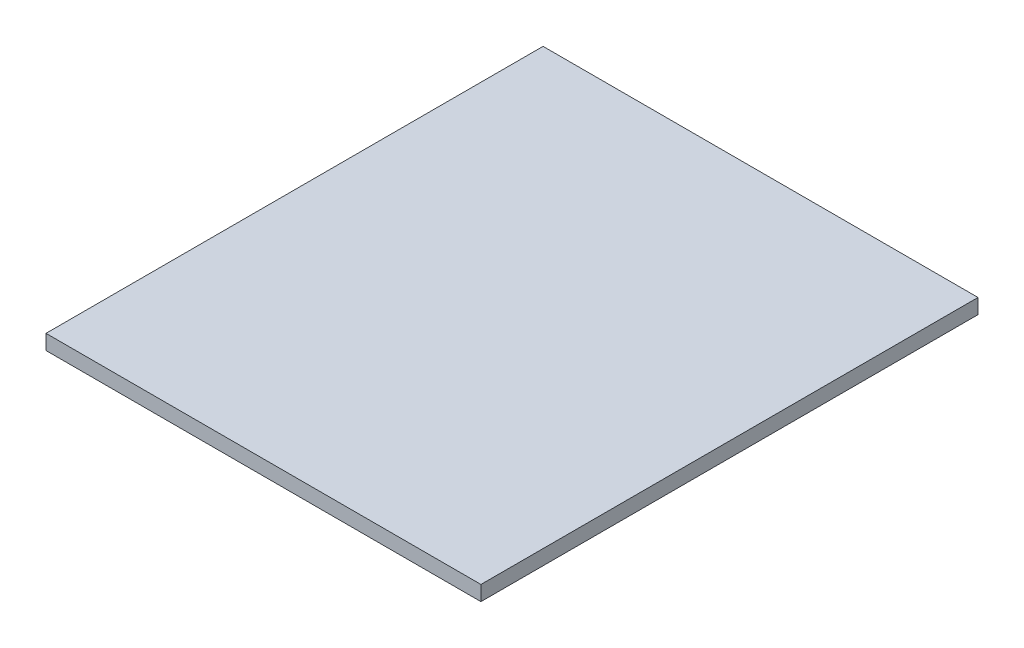
ISO-10303-21;
HEADER;
FILE_DESCRIPTION(('STEP AP214'),'2;1');
FILE_NAME('part.step','',(''),(''),'','','');
FILE_SCHEMA(('AUTOMOTIVE_DESIGN { 1 0 10303 214 1 1 1 1 }'));
ENDSEC;
DATA;
#1=APPLICATION_CONTEXT('core data for automotive mechanical design processes');
#2=APPLICATION_PROTOCOL_DEFINITION('international standard','automotive_design',2000,#1);
#3=PRODUCT_CONTEXT('',#1,'mechanical');
#4=PRODUCT('Part','Part','',(#3));
#5=PRODUCT_RELATED_PRODUCT_CATEGORY('part','',(#4));
#6=PRODUCT_DEFINITION_FORMATION('','',#4);
#7=PRODUCT_DEFINITION_CONTEXT('part definition',#1,'design');
#8=PRODUCT_DEFINITION('design','',#6,#7);
#9=PRODUCT_DEFINITION_SHAPE('','',#8);
#10=(LENGTH_UNIT() NAMED_UNIT(*) SI_UNIT(.MILLI.,.METRE.));
#11=(NAMED_UNIT(*) PLANE_ANGLE_UNIT() SI_UNIT($,.RADIAN.));
#12=(NAMED_UNIT(*) SI_UNIT($,.STERADIAN.) SOLID_ANGLE_UNIT());
#13=UNCERTAINTY_MEASURE_WITH_UNIT(LENGTH_MEASURE(1.E-05),#10,'distance_accuracy_value','');
#14=(GEOMETRIC_REPRESENTATION_CONTEXT(3) GLOBAL_UNCERTAINTY_ASSIGNED_CONTEXT((#13)) GLOBAL_UNIT_ASSIGNED_CONTEXT((#10,
#11,#12)) REPRESENTATION_CONTEXT('',''));
#15=CARTESIAN_POINT('',(0.,0.,0.));
#16=DIRECTION('',(0.,0.,1.));
#17=DIRECTION('',(1.,0.,0.));
#18=AXIS2_PLACEMENT_3D('',#15,#16,#17);
#19=CARTESIAN_POINT('',(0.,6.,0.));
#20=DIRECTION('',(1.,0.,0.));
#21=DIRECTION('',(0.,0.,-1.));
#22=AXIS2_PLACEMENT_3D('',#19,#20,#21);
#23=PLANE('',#22);
#24=DIRECTION('',(0.,0.,1.));
#25=VECTOR('',#24,1.);
#26=CARTESIAN_POINT('',(0.,0.,0.));
#27=LINE('',#26,#25);
#28=CARTESIAN_POINT('',(0.,0.,0.));
#29=VERTEX_POINT('',#28);
#30=CARTESIAN_POINT('',(0.,0.,200.));
#31=VERTEX_POINT('',#30);
#32=EDGE_CURVE('E95',#29,#31,#27,.T.);
#33=ORIENTED_EDGE('',*,*,#32,.T.);
#34=DIRECTION('',(0.,-1.,0.));
#35=VECTOR('',#34,1.);
#36=CARTESIAN_POINT('',(0.,6.,200.));
#37=LINE('',#36,#35);
#38=CARTESIAN_POINT('',(0.,6.,200.));
#39=VERTEX_POINT('',#38);
#40=EDGE_CURVE('E11',#39,#31,#37,.T.);
#41=ORIENTED_EDGE('',*,*,#40,.F.);
#42=DIRECTION('',(0.,0.,1.));
#43=VECTOR('',#42,1.);
#44=CARTESIAN_POINT('',(0.,6.,0.));
#45=LINE('',#44,#43);
#46=CARTESIAN_POINT('',(0.,6.,0.));
#47=VERTEX_POINT('',#46);
#48=EDGE_CURVE('E83',#47,#39,#45,.T.);
#49=ORIENTED_EDGE('',*,*,#48,.F.);
#50=DIRECTION('',(0.,-1.,0.));
#51=VECTOR('',#50,1.);
#52=CARTESIAN_POINT('',(0.,6.,0.));
#53=LINE('',#52,#51);
#54=EDGE_CURVE('E91',#47,#29,#53,.T.);
#55=ORIENTED_EDGE('',*,*,#54,.T.);
#56=EDGE_LOOP('',(#33,#41,#49,#55));
#57=FACE_BOUND('',#56,.T.);
#58=ADVANCED_FACE('F32',(#57),#23,.F.);
#59=CARTESIAN_POINT('',(0.,6.,200.));
#60=DIRECTION('',(0.,0.,-1.));
#61=DIRECTION('',(-1.,0.,0.));
#62=AXIS2_PLACEMENT_3D('',#59,#60,#61);
#63=PLANE('',#62);
#64=DIRECTION('',(1.,0.,0.));
#65=VECTOR('',#64,1.);
#66=CARTESIAN_POINT('',(0.,0.,200.));
#67=LINE('',#66,#65);
#68=CARTESIAN_POINT('',(175.,0.,200.));
#69=VERTEX_POINT('',#68);
#70=EDGE_CURVE('E87',#31,#69,#67,.T.);
#71=ORIENTED_EDGE('',*,*,#70,.T.);
#72=DIRECTION('',(0.,-1.,0.));
#73=VECTOR('',#72,1.);
#74=CARTESIAN_POINT('',(175.,6.,200.));
#75=LINE('',#74,#73);
#76=CARTESIAN_POINT('',(175.,6.,200.));
#77=VERTEX_POINT('',#76);
#78=EDGE_CURVE('E40',#77,#69,#75,.T.);
#79=ORIENTED_EDGE('',*,*,#78,.F.);
#80=DIRECTION('',(1.,0.,0.));
#81=VECTOR('',#80,1.);
#82=CARTESIAN_POINT('',(0.,6.,200.));
#83=LINE('',#82,#81);
#84=EDGE_CURVE('E78',#39,#77,#83,.T.);
#85=ORIENTED_EDGE('',*,*,#84,.F.);
#86=ORIENTED_EDGE('',*,*,#40,.T.);
#87=EDGE_LOOP('',(#71,#79,#85,#86));
#88=FACE_BOUND('',#87,.T.);
#89=ADVANCED_FACE('F86',(#88),#63,.F.);
#90=CARTESIAN_POINT('',(175.,6.,0.));
#91=DIRECTION('',(-1.,0.,0.));
#92=DIRECTION('',(0.,0.,1.));
#93=AXIS2_PLACEMENT_3D('',#90,#91,#92);
#94=PLANE('',#93);
#95=DIRECTION('',(0.,0.,-1.));
#96=VECTOR('',#95,1.);
#97=CARTESIAN_POINT('',(175.,0.,0.));
#98=LINE('',#97,#96);
#99=CARTESIAN_POINT('',(175.,0.,0.));
#100=VERTEX_POINT('',#99);
#101=EDGE_CURVE('E65',#69,#100,#98,.T.);
#102=ORIENTED_EDGE('',*,*,#101,.T.);
#103=DIRECTION('',(0.,-1.,0.));
#104=VECTOR('',#103,1.);
#105=CARTESIAN_POINT('',(175.,6.,0.));
#106=LINE('',#105,#104);
#107=CARTESIAN_POINT('',(175.,6.,0.));
#108=VERTEX_POINT('',#107);
#109=EDGE_CURVE('E88',#108,#100,#106,.T.);
#110=ORIENTED_EDGE('',*,*,#109,.F.);
#111=DIRECTION('',(0.,0.,-1.));
#112=VECTOR('',#111,1.);
#113=CARTESIAN_POINT('',(175.,6.,0.));
#114=LINE('',#113,#112);
#115=EDGE_CURVE('E81',#77,#108,#114,.T.);
#116=ORIENTED_EDGE('',*,*,#115,.F.);
#117=ORIENTED_EDGE('',*,*,#78,.T.);
#118=EDGE_LOOP('',(#102,#110,#116,#117));
#119=FACE_BOUND('',#118,.T.);
#120=ADVANCED_FACE('F89',(#119),#94,.F.);
#121=CARTESIAN_POINT('',(0.,6.,0.));
#122=DIRECTION('',(0.,0.,1.));
#123=DIRECTION('',(1.,0.,0.));
#124=AXIS2_PLACEMENT_3D('',#121,#122,#123);
#125=PLANE('',#124);
#126=DIRECTION('',(-1.,0.,0.));
#127=VECTOR('',#126,1.);
#128=CARTESIAN_POINT('',(0.,0.,0.));
#129=LINE('',#128,#127);
#130=EDGE_CURVE('E71',#100,#29,#129,.T.);
#131=ORIENTED_EDGE('',*,*,#130,.T.);
#132=ORIENTED_EDGE('',*,*,#54,.F.);
#133=DIRECTION('',(-1.,0.,0.));
#134=VECTOR('',#133,1.);
#135=CARTESIAN_POINT('',(0.,6.,0.));
#136=LINE('',#135,#134);
#137=EDGE_CURVE('E48',#108,#47,#136,.T.);
#138=ORIENTED_EDGE('',*,*,#137,.F.);
#139=ORIENTED_EDGE('',*,*,#109,.T.);
#140=EDGE_LOOP('',(#131,#132,#138,#139));
#141=FACE_BOUND('',#140,.T.);
#142=ADVANCED_FACE('F102',(#141),#125,.F.);
#143=CARTESIAN_POINT('',(0.,6.,0.));
#144=DIRECTION('',(0.,1.,0.));
#145=DIRECTION('',(0.,0.,1.));
#146=AXIS2_PLACEMENT_3D('',#143,#144,#145);
#147=PLANE('',#146);
#148=ORIENTED_EDGE('',*,*,#48,.T.);
#149=ORIENTED_EDGE('',*,*,#84,.T.);
#150=ORIENTED_EDGE('',*,*,#115,.T.);
#151=ORIENTED_EDGE('',*,*,#137,.T.);
#152=EDGE_LOOP('',(#148,#149,#150,#151));
#153=FACE_BOUND('',#152,.T.);
#154=ADVANCED_FACE('F79',(#153),#147,.T.);
#155=CARTESIAN_POINT('',(0.,0.,0.));
#156=DIRECTION('',(0.,1.,0.));
#157=DIRECTION('',(0.,0.,1.));
#158=AXIS2_PLACEMENT_3D('',#155,#156,#157);
#159=PLANE('',#158);
#160=ORIENTED_EDGE('',*,*,#32,.F.);
#161=ORIENTED_EDGE('',*,*,#130,.F.);
#162=ORIENTED_EDGE('',*,*,#101,.F.);
#163=ORIENTED_EDGE('',*,*,#70,.F.);
#164=EDGE_LOOP('',(#160,#161,#162,#163));
#165=FACE_BOUND('',#164,.T.);
#166=ADVANCED_FACE('F105',(#165),#159,.F.);
#167=CLOSED_SHELL('',(#58,#89,#120,#142,#154,#166));
#168=MANIFOLD_SOLID_BREP('B2',#167);
#169=ADVANCED_BREP_SHAPE_REPRESENTATION('',(#18,#168),#14);
#170=SHAPE_DEFINITION_REPRESENTATION(#9,#169);
ENDSEC;
END-ISO-10303-21;
